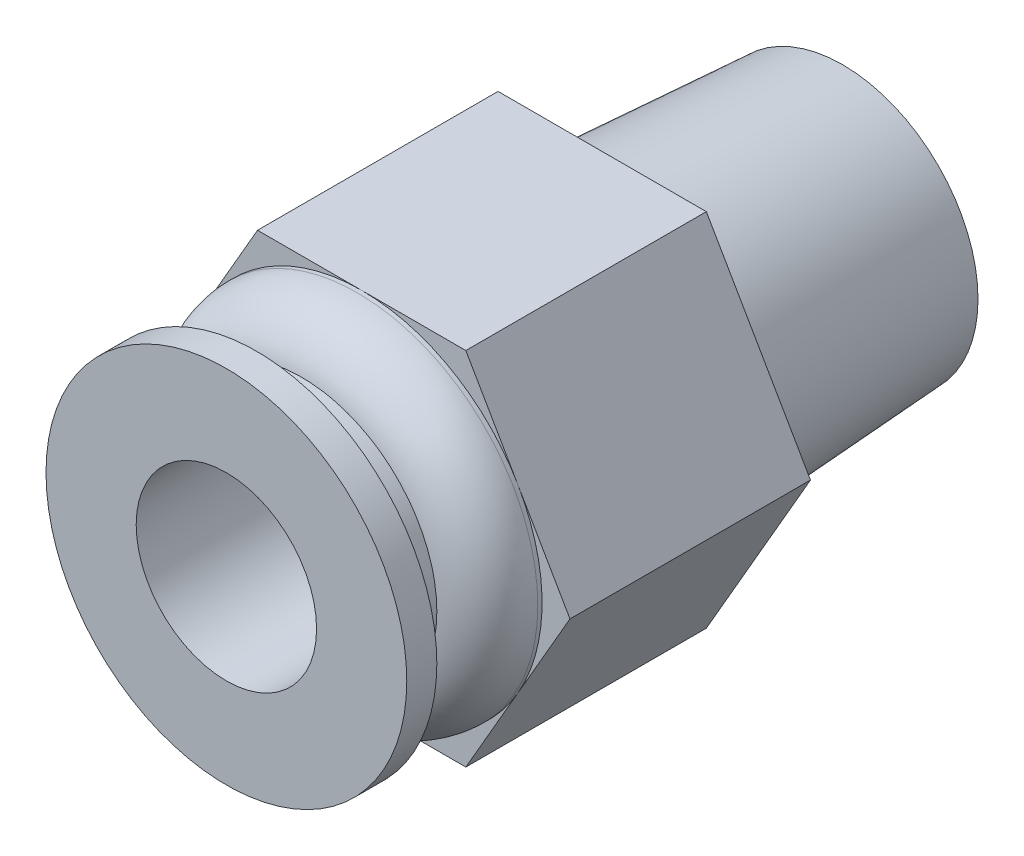
ISO-10303-21;
HEADER;
FILE_DESCRIPTION(('STEP AP214'),'2;1');
FILE_NAME('part.step','',(''),(''),'','','');
FILE_SCHEMA(('AUTOMOTIVE_DESIGN { 1 0 10303 214 1 1 1 1 }'));
ENDSEC;
DATA;
#1=APPLICATION_CONTEXT('core data for automotive mechanical design processes');
#2=APPLICATION_PROTOCOL_DEFINITION('international standard','automotive_design',2000,#1);
#3=PRODUCT_CONTEXT('',#1,'mechanical');
#4=PRODUCT('Part','Part','',(#3));
#5=PRODUCT_RELATED_PRODUCT_CATEGORY('part','',(#4));
#6=PRODUCT_DEFINITION_FORMATION('','',#4);
#7=PRODUCT_DEFINITION_CONTEXT('part definition',#1,'design');
#8=PRODUCT_DEFINITION('design','',#6,#7);
#9=PRODUCT_DEFINITION_SHAPE('','',#8);
#10=(LENGTH_UNIT() NAMED_UNIT(*) SI_UNIT(.MILLI.,.METRE.));
#11=(NAMED_UNIT(*) PLANE_ANGLE_UNIT() SI_UNIT($,.RADIAN.));
#12=(NAMED_UNIT(*) SI_UNIT($,.STERADIAN.) SOLID_ANGLE_UNIT());
#13=UNCERTAINTY_MEASURE_WITH_UNIT(LENGTH_MEASURE(1.E-05),#10,'distance_accuracy_value','');
#14=(GEOMETRIC_REPRESENTATION_CONTEXT(3) GLOBAL_UNCERTAINTY_ASSIGNED_CONTEXT((#13)) GLOBAL_UNIT_ASSIGNED_CONTEXT((#10,
#11,#12)) REPRESENTATION_CONTEXT('',''));
#15=CARTESIAN_POINT('',(0.,0.,0.));
#16=DIRECTION('',(0.,0.,1.));
#17=DIRECTION('',(1.,0.,0.));
#18=AXIS2_PLACEMENT_3D('',#15,#16,#17);
#19=CARTESIAN_POINT('',(0.,0.,16.));
#20=DIRECTION('',(0.,0.,1.));
#21=DIRECTION('',(1.,0.,0.));
#22=AXIS2_PLACEMENT_3D('',#19,#20,#21);
#23=PLANE('',#22);
#24=CARTESIAN_POINT('',(0.,0.,16.));
#25=DIRECTION('',(0.,0.,1.));
#26=DIRECTION('',(1.,0.,0.));
#27=AXIS2_PLACEMENT_3D('',#24,#25,#26);
#28=CIRCLE('',#27,6.);
#29=CARTESIAN_POINT('',(5.19615242270663,3.,16.));
#30=VERTEX_POINT('',#29);
#31=CARTESIAN_POINT('',(0.,6.,16.));
#32=VERTEX_POINT('',#31);
#33=EDGE_CURVE('E213',#30,#32,#28,.T.);
#34=ORIENTED_EDGE('',*,*,#33,.F.);
#35=DIRECTION('',(-0.5,0.866025403784439,0.));
#36=VECTOR('',#35,1.);
#37=CARTESIAN_POINT('',(6.92820323027551,0.,16.));
#38=LINE('',#37,#36);
#39=CARTESIAN_POINT('',(3.46410161513775,6.,16.));
#40=VERTEX_POINT('',#39);
#41=EDGE_CURVE('E221',#30,#40,#38,.T.);
#42=ORIENTED_EDGE('',*,*,#41,.T.);
#43=DIRECTION('',(-1.,0.,0.));
#44=VECTOR('',#43,1.);
#45=CARTESIAN_POINT('',(3.46410161513775,6.,16.));
#46=LINE('',#45,#44);
#47=EDGE_CURVE('E226',#40,#32,#46,.T.);
#48=ORIENTED_EDGE('',*,*,#47,.T.);
#49=EDGE_LOOP('',(#34,#42,#48));
#50=FACE_BOUND('',#49,.T.);
#51=ADVANCED_FACE('F39',(#50),#23,.T.);
#52=CARTESIAN_POINT('',(-5.19615242270663,3.,16.));
#53=VERTEX_POINT('',#52);
#54=EDGE_CURVE('E217',#32,#53,#28,.T.);
#55=ORIENTED_EDGE('',*,*,#54,.F.);
#56=CARTESIAN_POINT('',(-3.46410161513776,6.,16.));
#57=VERTEX_POINT('',#56);
#58=EDGE_CURVE('E225',#32,#57,#46,.T.);
#59=ORIENTED_EDGE('',*,*,#58,.T.);
#60=DIRECTION('',(-0.5,-0.866025403784439,0.));
#61=VECTOR('',#60,1.);
#62=CARTESIAN_POINT('',(-3.46410161513776,6.,16.));
#63=LINE('',#62,#61);
#64=EDGE_CURVE('E230',#57,#53,#63,.T.);
#65=ORIENTED_EDGE('',*,*,#64,.T.);
#66=EDGE_LOOP('',(#55,#59,#65));
#67=FACE_BOUND('',#66,.T.);
#68=ADVANCED_FACE('F345',(#67),#23,.T.);
#69=CARTESIAN_POINT('',(-5.19615242270663,-3.,16.));
#70=VERTEX_POINT('',#69);
#71=EDGE_CURVE('E362',#53,#70,#28,.T.);
#72=ORIENTED_EDGE('',*,*,#71,.F.);
#73=CARTESIAN_POINT('',(-6.92820323027551,0.,16.));
#74=VERTEX_POINT('',#73);
#75=EDGE_CURVE('E229',#53,#74,#63,.T.);
#76=ORIENTED_EDGE('',*,*,#75,.T.);
#77=DIRECTION('',(0.5,-0.866025403784439,0.));
#78=VECTOR('',#77,1.);
#79=CARTESIAN_POINT('',(-6.92820323027551,0.,16.));
#80=LINE('',#79,#78);
#81=EDGE_CURVE('E234',#74,#70,#80,.T.);
#82=ORIENTED_EDGE('',*,*,#81,.T.);
#83=EDGE_LOOP('',(#72,#76,#82));
#84=FACE_BOUND('',#83,.T.);
#85=ADVANCED_FACE('F350',(#84),#23,.T.);
#86=CARTESIAN_POINT('',(0.,-6.,16.));
#87=VERTEX_POINT('',#86);
#88=EDGE_CURVE('E361',#70,#87,#28,.T.);
#89=ORIENTED_EDGE('',*,*,#88,.F.);
#90=CARTESIAN_POINT('',(-3.46410161513776,-6.,16.));
#91=VERTEX_POINT('',#90);
#92=EDGE_CURVE('E233',#70,#91,#80,.T.);
#93=ORIENTED_EDGE('',*,*,#92,.T.);
#94=DIRECTION('',(1.,0.,0.));
#95=VECTOR('',#94,1.);
#96=CARTESIAN_POINT('',(-3.46410161513776,-6.,16.));
#97=LINE('',#96,#95);
#98=EDGE_CURVE('E238',#91,#87,#97,.T.);
#99=ORIENTED_EDGE('',*,*,#98,.T.);
#100=EDGE_LOOP('',(#89,#93,#99));
#101=FACE_BOUND('',#100,.T.);
#102=ADVANCED_FACE('F341',(#101),#23,.T.);
#103=CARTESIAN_POINT('',(5.19615242270663,-3.,16.));
#104=VERTEX_POINT('',#103);
#105=EDGE_CURVE('E69',#87,#104,#28,.T.);
#106=ORIENTED_EDGE('',*,*,#105,.F.);
#107=CARTESIAN_POINT('',(3.46410161513775,-6.,16.));
#108=VERTEX_POINT('',#107);
#109=EDGE_CURVE('E237',#87,#108,#97,.T.);
#110=ORIENTED_EDGE('',*,*,#109,.T.);
#111=DIRECTION('',(0.5,0.866025403784439,0.));
#112=VECTOR('',#111,1.);
#113=CARTESIAN_POINT('',(3.46410161513775,-6.,16.));
#114=LINE('',#113,#112);
#115=EDGE_CURVE('E219',#108,#104,#114,.T.);
#116=ORIENTED_EDGE('',*,*,#115,.T.);
#117=EDGE_LOOP('',(#106,#110,#116));
#118=FACE_BOUND('',#117,.T.);
#119=ADVANCED_FACE('F305',(#118),#23,.T.);
#120=CARTESIAN_POINT('',(0.,0.,0.));
#121=DIRECTION('',(0.,0.,1.));
#122=DIRECTION('',(1.,0.,0.));
#123=AXIS2_PLACEMENT_3D('',#120,#121,#122);
#124=CONICAL_SURFACE('',#123,4.5,0.0610865238198017);
#125=CARTESIAN_POINT('',(0.,0.,8.));
#126=DIRECTION('',(0.,0.,1.));
#127=DIRECTION('',(1.,0.,0.));
#128=AXIS2_PLACEMENT_3D('',#125,#126,#127);
#129=CIRCLE('',#128,4.98930096120387);
#130=CARTESIAN_POINT('',(4.98930096120387,0.,8.));
#131=VERTEX_POINT('',#130);
#132=EDGE_CURVE('E274',#131,#131,#129,.T.);
#133=ORIENTED_EDGE('',*,*,#132,.F.);
#134=EDGE_LOOP('',(#133));
#135=FACE_BOUND('',#134,.T.);
#136=CARTESIAN_POINT('',(0.,0.,0.));
#137=DIRECTION('',(0.,0.,1.));
#138=DIRECTION('',(1.,0.,0.));
#139=AXIS2_PLACEMENT_3D('',#136,#137,#138);
#140=CIRCLE('',#139,4.5);
#141=CARTESIAN_POINT('',(4.5,0.,0.));
#142=VERTEX_POINT('',#141);
#143=EDGE_CURVE('E271',#142,#142,#140,.T.);
#144=ORIENTED_EDGE('',*,*,#143,.T.);
#145=EDGE_LOOP('',(#144));
#146=FACE_BOUND('',#145,.T.);
#147=ADVANCED_FACE('F334',(#135,#146),#124,.T.);
#148=CARTESIAN_POINT('',(0.,0.,0.));
#149=DIRECTION('',(0.,0.,1.));
#150=DIRECTION('',(1.,0.,0.));
#151=AXIS2_PLACEMENT_3D('',#148,#149,#150);
#152=PLANE('',#151);
#153=CARTESIAN_POINT('',(0.,0.,0.));
#154=DIRECTION('',(0.,0.,-1.));
#155=DIRECTION('',(-1.,0.,0.));
#156=AXIS2_PLACEMENT_3D('',#153,#154,#155);
#157=CIRCLE('',#156,3.175);
#158=CARTESIAN_POINT('',(-3.175,0.,0.));
#159=VERTEX_POINT('',#158);
#160=EDGE_CURVE('E452',#159,#159,#157,.T.);
#161=ORIENTED_EDGE('',*,*,#160,.F.);
#162=EDGE_LOOP('',(#161));
#163=FACE_BOUND('',#162,.T.);
#164=ORIENTED_EDGE('',*,*,#143,.F.);
#165=EDGE_LOOP('',(#164));
#166=FACE_BOUND('',#165,.T.);
#167=ADVANCED_FACE('F331',(#163,#166),#152,.F.);
#168=CARTESIAN_POINT('',(3.46410161513775,-6.,16.));
#169=DIRECTION('',(-0.866025403784439,0.5,0.));
#170=DIRECTION('',(-0.5,-0.866025403784439,0.));
#171=AXIS2_PLACEMENT_3D('',#168,#169,#170);
#172=PLANE('',#171);
#173=DIRECTION('',(0.5,0.866025403784439,0.));
#174=VECTOR('',#173,1.);
#175=CARTESIAN_POINT('',(3.46410161513775,-6.,8.));
#176=LINE('',#175,#174);
#177=CARTESIAN_POINT('',(3.46410161513775,-6.,8.));
#178=VERTEX_POINT('',#177);
#179=CARTESIAN_POINT('',(6.92820323027551,0.,8.));
#180=VERTEX_POINT('',#179);
#181=EDGE_CURVE('E216',#178,#180,#176,.T.);
#182=ORIENTED_EDGE('',*,*,#181,.T.);
#183=DIRECTION('',(0.,0.,-1.));
#184=VECTOR('',#183,1.);
#185=CARTESIAN_POINT('',(6.92820323027551,0.,16.));
#186=LINE('',#185,#184);
#187=CARTESIAN_POINT('',(6.92820323027551,0.,16.));
#188=VERTEX_POINT('',#187);
#189=EDGE_CURVE('E268',#188,#180,#186,.T.);
#190=ORIENTED_EDGE('',*,*,#189,.F.);
#191=EDGE_CURVE('E222',#104,#188,#114,.T.);
#192=ORIENTED_EDGE('',*,*,#191,.F.);
#193=ORIENTED_EDGE('',*,*,#115,.F.);
#194=DIRECTION('',(0.,0.,-1.));
#195=VECTOR('',#194,1.);
#196=CARTESIAN_POINT('',(3.46410161513775,-6.,16.));
#197=LINE('',#196,#195);
#198=EDGE_CURVE('E241',#108,#178,#197,.T.);
#199=ORIENTED_EDGE('',*,*,#198,.T.);
#200=EDGE_LOOP('',(#182,#190,#192,#193,#199));
#201=FACE_BOUND('',#200,.T.);
#202=ADVANCED_FACE('F327',(#201),#172,.F.);
#203=CARTESIAN_POINT('',(6.92820323027551,0.,16.));
#204=DIRECTION('',(-0.866025403784439,-0.5,0.));
#205=DIRECTION('',(0.5,-0.866025403784439,0.));
#206=AXIS2_PLACEMENT_3D('',#203,#204,#205);
#207=PLANE('',#206);
#208=DIRECTION('',(-0.5,0.866025403784439,0.));
#209=VECTOR('',#208,1.);
#210=CARTESIAN_POINT('',(6.92820323027551,0.,8.));
#211=LINE('',#210,#209);
#212=CARTESIAN_POINT('',(3.46410161513775,6.,8.));
#213=VERTEX_POINT('',#212);
#214=EDGE_CURVE('E244',#180,#213,#211,.T.);
#215=ORIENTED_EDGE('',*,*,#214,.T.);
#216=DIRECTION('',(0.,0.,-1.));
#217=VECTOR('',#216,1.);
#218=CARTESIAN_POINT('',(3.46410161513775,6.,16.));
#219=LINE('',#218,#217);
#220=EDGE_CURVE('E265',#40,#213,#219,.T.);
#221=ORIENTED_EDGE('',*,*,#220,.F.);
#222=ORIENTED_EDGE('',*,*,#41,.F.);
#223=EDGE_CURVE('E223',#188,#30,#38,.T.);
#224=ORIENTED_EDGE('',*,*,#223,.F.);
#225=ORIENTED_EDGE('',*,*,#189,.T.);
#226=EDGE_LOOP('',(#215,#221,#222,#224,#225));
#227=FACE_BOUND('',#226,.T.);
#228=ADVANCED_FACE('F323',(#227),#207,.F.);
#229=CARTESIAN_POINT('',(3.46410161513775,6.,16.));
#230=DIRECTION('',(0.,-1.,0.));
#231=DIRECTION('',(0.,0.,-1.));
#232=AXIS2_PLACEMENT_3D('',#229,#230,#231);
#233=PLANE('',#232);
#234=DIRECTION('',(-1.,0.,0.));
#235=VECTOR('',#234,1.);
#236=CARTESIAN_POINT('',(3.46410161513775,6.,8.));
#237=LINE('',#236,#235);
#238=CARTESIAN_POINT('',(-3.46410161513776,6.,8.));
#239=VERTEX_POINT('',#238);
#240=EDGE_CURVE('E246',#213,#239,#237,.T.);
#241=ORIENTED_EDGE('',*,*,#240,.T.);
#242=DIRECTION('',(0.,0.,-1.));
#243=VECTOR('',#242,1.);
#244=CARTESIAN_POINT('',(-3.46410161513776,6.,16.));
#245=LINE('',#244,#243);
#246=EDGE_CURVE('E262',#57,#239,#245,.T.);
#247=ORIENTED_EDGE('',*,*,#246,.F.);
#248=ORIENTED_EDGE('',*,*,#58,.F.);
#249=ORIENTED_EDGE('',*,*,#47,.F.);
#250=ORIENTED_EDGE('',*,*,#220,.T.);
#251=EDGE_LOOP('',(#241,#247,#248,#249,#250));
#252=FACE_BOUND('',#251,.T.);
#253=ADVANCED_FACE('F319',(#252),#233,.F.);
#254=CARTESIAN_POINT('',(-3.46410161513776,6.,16.));
#255=DIRECTION('',(0.866025403784439,-0.5,0.));
#256=DIRECTION('',(0.5,0.866025403784439,0.));
#257=AXIS2_PLACEMENT_3D('',#254,#255,#256);
#258=PLANE('',#257);
#259=DIRECTION('',(-0.5,-0.866025403784439,0.));
#260=VECTOR('',#259,1.);
#261=CARTESIAN_POINT('',(-3.46410161513776,6.,8.));
#262=LINE('',#261,#260);
#263=CARTESIAN_POINT('',(-6.92820323027551,0.,8.));
#264=VERTEX_POINT('',#263);
#265=EDGE_CURVE('E248',#239,#264,#262,.T.);
#266=ORIENTED_EDGE('',*,*,#265,.T.);
#267=DIRECTION('',(0.,0.,-1.));
#268=VECTOR('',#267,1.);
#269=CARTESIAN_POINT('',(-6.92820323027551,0.,16.));
#270=LINE('',#269,#268);
#271=EDGE_CURVE('E259',#74,#264,#270,.T.);
#272=ORIENTED_EDGE('',*,*,#271,.F.);
#273=ORIENTED_EDGE('',*,*,#75,.F.);
#274=ORIENTED_EDGE('',*,*,#64,.F.);
#275=ORIENTED_EDGE('',*,*,#246,.T.);
#276=EDGE_LOOP('',(#266,#272,#273,#274,#275));
#277=FACE_BOUND('',#276,.T.);
#278=ADVANCED_FACE('F315',(#277),#258,.F.);
#279=CARTESIAN_POINT('',(-6.92820323027551,0.,16.));
#280=DIRECTION('',(0.866025403784439,0.5,0.));
#281=DIRECTION('',(-0.5,0.866025403784439,0.));
#282=AXIS2_PLACEMENT_3D('',#279,#280,#281);
#283=PLANE('',#282);
#284=DIRECTION('',(0.5,-0.866025403784439,0.));
#285=VECTOR('',#284,1.);
#286=CARTESIAN_POINT('',(-6.92820323027551,0.,8.));
#287=LINE('',#286,#285);
#288=CARTESIAN_POINT('',(-3.46410161513776,-6.,8.));
#289=VERTEX_POINT('',#288);
#290=EDGE_CURVE('E250',#264,#289,#287,.T.);
#291=ORIENTED_EDGE('',*,*,#290,.T.);
#292=DIRECTION('',(0.,0.,-1.));
#293=VECTOR('',#292,1.);
#294=CARTESIAN_POINT('',(-3.46410161513776,-6.,16.));
#295=LINE('',#294,#293);
#296=EDGE_CURVE('E256',#91,#289,#295,.T.);
#297=ORIENTED_EDGE('',*,*,#296,.F.);
#298=ORIENTED_EDGE('',*,*,#92,.F.);
#299=ORIENTED_EDGE('',*,*,#81,.F.);
#300=ORIENTED_EDGE('',*,*,#271,.T.);
#301=EDGE_LOOP('',(#291,#297,#298,#299,#300));
#302=FACE_BOUND('',#301,.T.);
#303=ADVANCED_FACE('F311',(#302),#283,.F.);
#304=CARTESIAN_POINT('',(-3.46410161513776,-6.,16.));
#305=DIRECTION('',(0.,1.,0.));
#306=DIRECTION('',(-1.,0.,0.));
#307=AXIS2_PLACEMENT_3D('',#304,#305,#306);
#308=PLANE('',#307);
#309=DIRECTION('',(1.,0.,0.));
#310=VECTOR('',#309,1.);
#311=CARTESIAN_POINT('',(-3.46410161513776,-6.,8.));
#312=LINE('',#311,#310);
#313=EDGE_CURVE('E252',#289,#178,#312,.T.);
#314=ORIENTED_EDGE('',*,*,#313,.T.);
#315=ORIENTED_EDGE('',*,*,#198,.F.);
#316=ORIENTED_EDGE('',*,*,#109,.F.);
#317=ORIENTED_EDGE('',*,*,#98,.F.);
#318=ORIENTED_EDGE('',*,*,#296,.T.);
#319=EDGE_LOOP('',(#314,#315,#316,#317,#318));
#320=FACE_BOUND('',#319,.T.);
#321=ADVANCED_FACE('F303',(#320),#308,.F.);
#322=EDGE_CURVE('E218',#104,#30,#28,.T.);
#323=ORIENTED_EDGE('',*,*,#322,.F.);
#324=ORIENTED_EDGE('',*,*,#191,.T.);
#325=ORIENTED_EDGE('',*,*,#223,.T.);
#326=EDGE_LOOP('',(#323,#324,#325));
#327=FACE_BOUND('',#326,.T.);
#328=ADVANCED_FACE('F300',(#327),#23,.T.);
#329=CARTESIAN_POINT('',(0.,0.,8.));
#330=DIRECTION('',(0.,0.,1.));
#331=DIRECTION('',(1.,0.,0.));
#332=AXIS2_PLACEMENT_3D('',#329,#330,#331);
#333=PLANE('',#332);
#334=ORIENTED_EDGE('',*,*,#132,.T.);
#335=EDGE_LOOP('',(#334));
#336=FACE_BOUND('',#335,.T.);
#337=ORIENTED_EDGE('',*,*,#181,.F.);
#338=ORIENTED_EDGE('',*,*,#313,.F.);
#339=ORIENTED_EDGE('',*,*,#290,.F.);
#340=ORIENTED_EDGE('',*,*,#265,.F.);
#341=ORIENTED_EDGE('',*,*,#240,.F.);
#342=ORIENTED_EDGE('',*,*,#214,.F.);
#343=EDGE_LOOP('',(#337,#338,#339,#340,#341,#342));
#344=FACE_BOUND('',#343,.T.);
#345=ADVANCED_FACE('F297',(#336,#344),#333,.F.);
#346=CARTESIAN_POINT('',(0.,0.,18.));
#347=DIRECTION('',(0.,0.,-1.));
#348=DIRECTION('',(-1.,0.,0.));
#349=AXIS2_PLACEMENT_3D('',#346,#347,#348);
#350=CYLINDRICAL_SURFACE('',#349,6.);
#351=CARTESIAN_POINT('',(6.,0.,16.1425824378993));
#352=CARTESIAN_POINT('',(6.,0.785398159762403,16.1425824378993));
#353=CARTESIAN_POINT('',(5.8438360586185,1.57048730951482,16.1425824378993));
#354=CARTESIAN_POINT('',(5.24271833151695,3.02171387886626,16.1425824378993));
#355=CARTESIAN_POINT('',(4.798001051818,3.68728032242057,16.1425824378993));
#356=CARTESIAN_POINT('',(3.68728032242057,4.798001051818,16.1425824378993));
#357=CARTESIAN_POINT('',(3.02171387886599,5.24271833151706,16.1425824378993));
#358=CARTESIAN_POINT('',(1.57048730951508,5.84383605861839,16.1425824378993));
#359=CARTESIAN_POINT('',(0.785398159761346,6.,16.1425824378993));
#360=CARTESIAN_POINT('',(-0.785398159761346,6.,16.1425824378993));
#361=CARTESIAN_POINT('',(-1.57048730951479,5.8438360586185,16.1425824378993));
#362=CARTESIAN_POINT('',(-3.02171387886629,5.24271833151694,16.1425824378993));
#363=CARTESIAN_POINT('',(-3.68728032242064,4.79800105181794,16.1425824378993));
#364=CARTESIAN_POINT('',(-4.79800105181794,3.68728032242063,16.1425824378993));
#365=CARTESIAN_POINT('',(-5.24271833151698,3.02171387886617,16.1425824378993));
#366=CARTESIAN_POINT('',(-5.84383605861845,1.57048730951492,16.1425824378993));
#367=CARTESIAN_POINT('',(-6.,0.785398159761347,16.1425824378993));
#368=CARTESIAN_POINT('',(-6.,-0.785398159761345,16.1425824378993));
#369=CARTESIAN_POINT('',(-5.84383605861841,-1.57048730951502,16.1425824378993));
#370=CARTESIAN_POINT('',(-5.24271833151704,-3.02171387886604,16.1425824378993));
#371=CARTESIAN_POINT('',(-4.79800105181794,-3.68728032242064,16.1425824378993));
#372=CARTESIAN_POINT('',(-3.68728032242063,-4.79800105181794,16.1425824378993));
#373=CARTESIAN_POINT('',(-3.02171387886605,-5.24271833151703,16.1425824378993));
#374=CARTESIAN_POINT('',(-1.57048730951504,-5.8438360586184,16.1425824378993));
#375=CARTESIAN_POINT('',(-0.785398159761338,-6.,16.1425824378993));
#376=CARTESIAN_POINT('',(0.785398159761357,-6.,16.1425824378993));
#377=CARTESIAN_POINT('',(1.57048730951517,-5.84383605861835,16.1425824378993));
#378=CARTESIAN_POINT('',(3.02171387886589,-5.2427183315171,16.1425824378993));
#379=CARTESIAN_POINT('',(3.68728032242045,-4.79800105181812,16.1425824378993));
#380=CARTESIAN_POINT('',(4.7980010518181,-3.68728032242048,16.1425824378993));
#381=CARTESIAN_POINT('',(5.24271833151709,-3.02171387886591,16.1425824378993));
#382=CARTESIAN_POINT('',(5.84383605861834,-1.57048730951519,16.1425824378993));
#383=CARTESIAN_POINT('',(6.,-0.785398159762404,16.1425824378993));
#384=CARTESIAN_POINT('',(6.,0.,16.1425824378993));
#385=(BOUNDED_CURVE() B_SPLINE_CURVE(3,(#351,#352,#353,#354,#355,#356,#357,#358,#359,#360,#361,
#362,#363,#364,#365,#366,#367,#368,#369,#370,#371,#372,#373,#374,#375,#376,#377,#378,#379,#380,
#381,#382,#383,#384),.UNSPECIFIED.,.T.,.F.) B_SPLINE_CURVE_WITH_KNOTS((4,2,2,2,2,2,2,2,2,2,2,2,
2,2,2,2,4),(0.,0.392699081698724,0.785398163397448,1.17809724509617,1.5707963267949,
1.96349540849362,2.35619449019234,2.74889357189107,3.14159265358979,3.53429173528852,
3.92699081698724,4.31968989868597,4.71238898038469,5.10508806208341,5.49778714378214,
5.89048622548086,6.28318530717959),
.UNSPECIFIED.) CURVE() GEOMETRIC_REPRESENTATION_ITEM() RATIONAL_B_SPLINE_CURVE((1.,1.,1.,1.,1.,
1.,1.,1.,1.,1.,1.,1.,1.,1.,1.,1.,1.,1.,1.,1.,1.,1.,1.,1.,1.,1.,1.,1.,1.,1.,1.,1.,1.,1.)) REPRESENTATION_ITEM(''));
#386=CARTESIAN_POINT('',(6.,0.,16.1425824378993));
#387=VERTEX_POINT('',#386);
#388=EDGE_CURVE('E53',#387,#387,#385,.F.);
#389=ORIENTED_EDGE('',*,*,#388,.T.);
#390=EDGE_LOOP('',(#389));
#391=FACE_BOUND('',#390,.T.);
#392=ORIENTED_EDGE('',*,*,#33,.T.);
#393=ORIENTED_EDGE('',*,*,#54,.T.);
#394=ORIENTED_EDGE('',*,*,#71,.T.);
#395=ORIENTED_EDGE('',*,*,#88,.T.);
#396=ORIENTED_EDGE('',*,*,#105,.T.);
#397=ORIENTED_EDGE('',*,*,#322,.T.);
#398=EDGE_LOOP('',(#392,#393,#394,#395,#396,#397));
#399=FACE_BOUND('',#398,.T.);
#400=ADVANCED_FACE('F287',(#391,#399),#350,.T.);
#401=CARTESIAN_POINT('',(0.,0.,18.5));
#402=DIRECTION('',(0.,0.,-1.));
#403=DIRECTION('',(-1.,0.,0.));
#404=AXIS2_PLACEMENT_3D('',#401,#402,#403);
#405=CYLINDRICAL_SURFACE('',#404,4.5);
#406=CARTESIAN_POINT('',(0.,0.,18.5));
#407=DIRECTION('',(0.,0.,1.));
#408=DIRECTION('',(1.,0.,0.));
#409=AXIS2_PLACEMENT_3D('',#406,#407,#408);
#410=CIRCLE('',#409,4.5);
#411=CARTESIAN_POINT('',(4.5,0.,18.5));
#412=VERTEX_POINT('',#411);
#413=EDGE_CURVE('E209',#412,#412,#410,.T.);
#414=ORIENTED_EDGE('',*,*,#413,.F.);
#415=EDGE_LOOP('',(#414));
#416=FACE_BOUND('',#415,.T.);
#417=CARTESIAN_POINT('',(4.5,0.,18.));
#418=CARTESIAN_POINT('',(4.5,-0.589048619821803,18.));
#419=CARTESIAN_POINT('',(4.38287704396395,-1.17786548213645,18.));
#420=CARTESIAN_POINT('',(3.93203874863763,-2.26628540914936,18.));
#421=CARTESIAN_POINT('',(3.59850078886344,-2.76546024181531,18.));
#422=CARTESIAN_POINT('',(2.76546024181546,-3.59850078886363,18.));
#423=CARTESIAN_POINT('',(2.26628540914944,-3.93203874863763,18.));
#424=CARTESIAN_POINT('',(1.17786548213636,-4.38287704396395,18.));
#425=CARTESIAN_POINT('',(0.589048619821017,-4.5,18.));
#426=CARTESIAN_POINT('',(-0.589048619821003,-4.5,18.));
#427=CARTESIAN_POINT('',(-1.17786548213637,-4.38287704396395,18.));
#428=CARTESIAN_POINT('',(-2.26628540914945,-3.93203874863763,18.));
#429=CARTESIAN_POINT('',(-2.76546024181564,-3.59850078886346,18.));
#430=CARTESIAN_POINT('',(-3.59850078886328,-2.76546024181548,18.));
#431=CARTESIAN_POINT('',(-3.93203874863763,-2.26628540914961,18.));
#432=CARTESIAN_POINT('',(-4.38287704396395,-1.17786548213619,18.));
#433=CARTESIAN_POINT('',(-4.5,-0.589048619821009,18.));
#434=CARTESIAN_POINT('',(-4.5,0.58904861982101,18.));
#435=CARTESIAN_POINT('',(-4.38287704396395,1.1778654821362,18.));
#436=CARTESIAN_POINT('',(-3.93203874863763,2.26628540914962,18.));
#437=CARTESIAN_POINT('',(-3.59850078886329,2.76546024181547,18.));
#438=CARTESIAN_POINT('',(-2.76546024181565,3.59850078886345,18.));
#439=CARTESIAN_POINT('',(-2.26628540914957,3.93203874863767,18.));
#440=CARTESIAN_POINT('',(-1.17786548213624,4.38287704396391,18.));
#441=CARTESIAN_POINT('',(-0.589048619821009,4.5,18.));
#442=CARTESIAN_POINT('',(0.58904861982101,4.5,18.));
#443=CARTESIAN_POINT('',(1.17786548213623,4.38287704396391,18.));
#444=CARTESIAN_POINT('',(2.26628540914957,3.93203874863767,18.));
#445=CARTESIAN_POINT('',(2.7654602418156,3.59850078886333,18.));
#446=CARTESIAN_POINT('',(3.59850078886333,2.7654602418156,18.));
#447=CARTESIAN_POINT('',(3.93203874863767,2.26628540914949,18.));
#448=CARTESIAN_POINT('',(4.38287704396391,1.17786548213632,18.));
#449=CARTESIAN_POINT('',(4.5,0.589048619821802,18.));
#450=CARTESIAN_POINT('',(4.5,0.,18.));
#451=(BOUNDED_CURVE() B_SPLINE_CURVE(3,(#417,#418,#419,#420,#421,#422,#423,#424,#425,#426,#427,
#428,#429,#430,#431,#432,#433,#434,#435,#436,#437,#438,#439,#440,#441,#442,#443,#444,#445,#446,
#447,#448,#449,#450),.UNSPECIFIED.,.T.,.F.) B_SPLINE_CURVE_WITH_KNOTS((4,2,2,2,2,2,2,2,2,2,2,2,
2,2,2,2,4),(0.,0.392699081698725,0.785398163397448,1.17809724509617,1.5707963267949,
1.96349540849362,2.35619449019234,2.74889357189107,3.14159265358979,3.53429173528852,
3.92699081698724,4.31968989868597,4.71238898038469,5.10508806208341,5.49778714378214,
5.89048622548086,6.28318530717959),
.UNSPECIFIED.) CURVE() GEOMETRIC_REPRESENTATION_ITEM() RATIONAL_B_SPLINE_CURVE((1.,1.,1.,1.,1.,
1.,1.,1.,1.,1.,1.,1.,1.,1.,1.,1.,1.,1.,1.,1.,1.,1.,1.,1.,1.,1.,1.,1.,1.,1.,1.,1.,1.,1.)) REPRESENTATION_ITEM(''));
#452=CARTESIAN_POINT('',(4.5,0.,18.));
#453=VERTEX_POINT('',#452);
#454=EDGE_CURVE('E364',#453,#453,#451,.F.);
#455=ORIENTED_EDGE('',*,*,#454,.T.);
#456=EDGE_LOOP('',(#455));
#457=FACE_BOUND('',#456,.T.);
#458=ADVANCED_FACE('F296',(#416,#457),#405,.T.);
#459=CARTESIAN_POINT('',(0.,0.,18.5));
#460=DIRECTION('',(0.,0.,1.));
#461=DIRECTION('',(1.,0.,0.));
#462=AXIS2_PLACEMENT_3D('',#459,#460,#461);
#463=PLANE('',#462);
#464=CARTESIAN_POINT('',(0.,0.,18.5));
#465=DIRECTION('',(0.,0.,1.));
#466=DIRECTION('',(1.,0.,0.));
#467=AXIS2_PLACEMENT_3D('',#464,#465,#466);
#468=CIRCLE('',#467,3.75);
#469=CARTESIAN_POINT('',(3.75,0.,18.5));
#470=VERTEX_POINT('',#469);
#471=EDGE_CURVE('E14',#470,#470,#468,.T.);
#472=ORIENTED_EDGE('',*,*,#471,.F.);
#473=EDGE_LOOP('',(#472));
#474=FACE_BOUND('',#473,.T.);
#475=ORIENTED_EDGE('',*,*,#413,.T.);
#476=EDGE_LOOP('',(#475));
#477=FACE_BOUND('',#476,.T.);
#478=ADVANCED_FACE('F387',(#474,#477),#463,.T.);
#479=CARTESIAN_POINT('',(4.5,0.,18.));
#480=CARTESIAN_POINT('',(4.5,0.589048619821802,18.));
#481=CARTESIAN_POINT('',(4.38287704396391,1.17786548213632,18.));
#482=CARTESIAN_POINT('',(3.93203874863767,2.26628540914949,18.));
#483=CARTESIAN_POINT('',(3.59850078886333,2.7654602418156,18.));
#484=CARTESIAN_POINT('',(2.7654602418156,3.59850078886333,18.));
#485=CARTESIAN_POINT('',(2.26628540914957,3.93203874863767,18.));
#486=CARTESIAN_POINT('',(1.17786548213623,4.38287704396391,18.));
#487=CARTESIAN_POINT('',(0.58904861982101,4.5,18.));
#488=CARTESIAN_POINT('',(-0.589048619821009,4.5,18.));
#489=CARTESIAN_POINT('',(-1.17786548213624,4.38287704396391,18.));
#490=CARTESIAN_POINT('',(-2.26628540914957,3.93203874863767,18.));
#491=CARTESIAN_POINT('',(-2.76546024181565,3.59850078886345,18.));
#492=CARTESIAN_POINT('',(-3.59850078886329,2.76546024181547,18.));
#493=CARTESIAN_POINT('',(-3.93203874863763,2.26628540914962,18.));
#494=CARTESIAN_POINT('',(-4.38287704396395,1.1778654821362,18.));
#495=CARTESIAN_POINT('',(-4.5,0.58904861982101,18.));
#496=CARTESIAN_POINT('',(-4.5,-0.589048619821009,18.));
#497=CARTESIAN_POINT('',(-4.38287704396395,-1.17786548213619,18.));
#498=CARTESIAN_POINT('',(-3.93203874863763,-2.26628540914961,18.));
#499=CARTESIAN_POINT('',(-3.59850078886328,-2.76546024181548,18.));
#500=CARTESIAN_POINT('',(-2.76546024181564,-3.59850078886346,18.));
#501=CARTESIAN_POINT('',(-2.26628540914945,-3.93203874863763,18.));
#502=CARTESIAN_POINT('',(-1.17786548213637,-4.38287704396395,18.));
#503=CARTESIAN_POINT('',(-0.589048619821003,-4.5,18.));
#504=CARTESIAN_POINT('',(0.589048619821017,-4.5,18.));
#505=CARTESIAN_POINT('',(1.17786548213636,-4.38287704396395,18.));
#506=CARTESIAN_POINT('',(2.26628540914944,-3.93203874863763,18.));
#507=CARTESIAN_POINT('',(2.76546024181546,-3.59850078886363,18.));
#508=CARTESIAN_POINT('',(3.59850078886344,-2.76546024181531,18.));
#509=CARTESIAN_POINT('',(3.93203874863763,-2.26628540914936,18.));
#510=CARTESIAN_POINT('',(4.38287704396395,-1.17786548213645,18.));
#511=CARTESIAN_POINT('',(4.5,-0.589048619821803,18.));
#512=CARTESIAN_POINT('',(4.5,0.,18.));
#513=CARTESIAN_POINT('',(6.,0.,17.6769708587651));
#514=CARTESIAN_POINT('',(6.,0.785398159762403,17.6769708587651));
#515=CARTESIAN_POINT('',(5.84383605861923,1.57048730951498,17.6769708587651));
#516=CARTESIAN_POINT('',(5.24271833151622,3.0217138788661,17.6769708587651));
#517=CARTESIAN_POINT('',(4.798001051818,3.68728032242057,17.6769708587651));
#518=CARTESIAN_POINT('',(3.68728032242057,4.798001051818,17.6769708587651));
#519=CARTESIAN_POINT('',(3.02171387886593,5.2427183315169,17.6769708587651));
#520=CARTESIAN_POINT('',(1.57048730951515,5.84383605861855,17.6769708587651));
#521=CARTESIAN_POINT('',(0.785398159761346,6.00000000000034,17.6769708587651));
#522=CARTESIAN_POINT('',(-0.785398159761346,5.99999999999966,17.6769708587651));
#523=CARTESIAN_POINT('',(-1.57048730951481,5.84383605861889,17.6769708587651));
#524=CARTESIAN_POINT('',(-3.02171387886627,5.24271833151655,17.6769708587651));
#525=CARTESIAN_POINT('',(-3.68728032242063,4.79800105181794,17.6769708587651));
#526=CARTESIAN_POINT('',(-4.79800105181794,3.68728032242063,17.6769708587651));
#527=CARTESIAN_POINT('',(-5.24271833151695,3.02171387886616,17.6769708587651));
#528=CARTESIAN_POINT('',(-5.84383605861848,1.57048730951493,17.6769708587651));
#529=CARTESIAN_POINT('',(-6.,0.785398159761347,17.6769708587651));
#530=CARTESIAN_POINT('',(-6.,-0.785398159761345,17.6769708587651));
#531=CARTESIAN_POINT('',(-5.84383605861815,-1.57048730951492,17.6769708587651));
#532=CARTESIAN_POINT('',(-5.2427183315173,-3.02171387886615,17.6769708587651));
#533=CARTESIAN_POINT('',(-4.79800105181794,-3.68728032242063,17.6769708587651));
#534=CARTESIAN_POINT('',(-3.68728032242063,-4.79800105181794,17.6769708587651));
#535=CARTESIAN_POINT('',(-3.02171387886616,-5.24271833151729,17.6769708587651));
#536=CARTESIAN_POINT('',(-1.57048730951493,-5.84383605861814,17.6769708587651));
#537=CARTESIAN_POINT('',(-0.785398159761338,-6.,17.6769708587651));
#538=CARTESIAN_POINT('',(0.785398159761357,-6.,17.6769708587651));
#539=CARTESIAN_POINT('',(1.57048730951508,-5.84383605861815,17.6769708587651));
#540=CARTESIAN_POINT('',(3.02171387886597,-5.2427183315173,17.6769708587651));
#541=CARTESIAN_POINT('',(3.68728032242062,-4.79800105181829,17.6769708587651));
#542=CARTESIAN_POINT('',(4.79800105181793,-3.6872803224203,17.6769708587651));
#543=CARTESIAN_POINT('',(5.24271833151729,-3.02171387886599,17.6769708587651));
#544=CARTESIAN_POINT('',(5.84383605861814,-1.5704873095151,17.6769708587651));
#545=CARTESIAN_POINT('',(6.,-0.785398159762404,17.6769708587651));
#546=CARTESIAN_POINT('',(6.,0.,17.6769708587651));
#547=CARTESIAN_POINT('',(6.,0.,16.1425824378993));
#548=CARTESIAN_POINT('',(6.,0.785398159762403,16.1425824378993));
#549=CARTESIAN_POINT('',(5.8438360586185,1.57048730951482,16.1425824378993));
#550=CARTESIAN_POINT('',(5.24271833151695,3.02171387886626,16.1425824378993));
#551=CARTESIAN_POINT('',(4.798001051818,3.68728032242057,16.1425824378993));
#552=CARTESIAN_POINT('',(3.68728032242057,4.798001051818,16.1425824378993));
#553=CARTESIAN_POINT('',(3.02171387886599,5.24271833151706,16.1425824378993));
#554=CARTESIAN_POINT('',(1.57048730951508,5.84383605861839,16.1425824378993));
#555=CARTESIAN_POINT('',(0.785398159761346,6.,16.1425824378993));
#556=CARTESIAN_POINT('',(-0.785398159761346,6.,16.1425824378993));
#557=CARTESIAN_POINT('',(-1.57048730951479,5.8438360586185,16.1425824378993));
#558=CARTESIAN_POINT('',(-3.02171387886629,5.24271833151694,16.1425824378993));
#559=CARTESIAN_POINT('',(-3.68728032242064,4.79800105181794,16.1425824378993));
#560=CARTESIAN_POINT('',(-4.79800105181794,3.68728032242063,16.1425824378993));
#561=CARTESIAN_POINT('',(-5.24271833151698,3.02171387886617,16.1425824378993));
#562=CARTESIAN_POINT('',(-5.84383605861845,1.57048730951492,16.1425824378993));
#563=CARTESIAN_POINT('',(-6.,0.785398159761347,16.1425824378993));
#564=CARTESIAN_POINT('',(-6.,-0.785398159761345,16.1425824378993));
#565=CARTESIAN_POINT('',(-5.84383605861841,-1.57048730951502,16.1425824378993));
#566=CARTESIAN_POINT('',(-5.24271833151704,-3.02171387886604,16.1425824378993));
#567=CARTESIAN_POINT('',(-4.79800105181794,-3.68728032242064,16.1425824378993));
#568=CARTESIAN_POINT('',(-3.68728032242063,-4.79800105181794,16.1425824378993));
#569=CARTESIAN_POINT('',(-3.02171387886605,-5.24271833151703,16.1425824378993));
#570=CARTESIAN_POINT('',(-1.57048730951504,-5.8438360586184,16.1425824378993));
#571=CARTESIAN_POINT('',(-0.785398159761338,-6.,16.1425824378993));
#572=CARTESIAN_POINT('',(0.785398159761357,-6.,16.1425824378993));
#573=CARTESIAN_POINT('',(1.57048730951517,-5.84383605861835,16.1425824378993));
#574=CARTESIAN_POINT('',(3.02171387886589,-5.2427183315171,16.1425824378993));
#575=CARTESIAN_POINT('',(3.68728032242045,-4.79800105181812,16.1425824378993));
#576=CARTESIAN_POINT('',(4.7980010518181,-3.68728032242048,16.1425824378993));
#577=CARTESIAN_POINT('',(5.24271833151709,-3.02171387886591,16.1425824378993));
#578=CARTESIAN_POINT('',(5.84383605861834,-1.57048730951519,16.1425824378993));
#579=CARTESIAN_POINT('',(6.,-0.785398159762404,16.1425824378993));
#580=CARTESIAN_POINT('',(6.,0.,16.1425824378993));
#581=(BOUNDED_SURFACE() B_SPLINE_SURFACE(2,3,((#479,#480,#481,#482,#483,#484,#485,#486,#487,
#488,#489,#490,#491,#492,#493,#494,#495,#496,#497,#498,#499,#500,#501,#502,#503,#504,#505,#506,
#507,#508,#509,#510,#511,#512),(#513,#514,#515,#516,#517,#518,#519,#520,#521,#522,#523,#524,
#525,#526,#527,#528,#529,#530,#531,#532,#533,#534,#535,#536,#537,#538,#539,#540,#541,#542,#543,
#544,#545,#546),(#547,#548,#549,#550,#551,#552,#553,#554,#555,#556,#557,#558,#559,#560,#561,
#562,#563,#564,#565,#566,#567,#568,#569,#570,#571,#572,#573,#574,#575,#576,#577,#578,#579,
#580)),.UNSPECIFIED.,.F.,.T.,.F.) B_SPLINE_SURFACE_WITH_KNOTS((3,3),(4,2,2,2,2,2,2,2,2,2,2,2,2,
2,2,2,4),(0.,1.),(0.,0.392699081698724,0.785398163397448,1.17809724509617,1.5707963267949,
1.96349540849362,2.35619449019234,2.74889357189107,3.14159265358979,3.53429173528852,
3.92699081698724,4.31968989868597,4.71238898038469,5.10508806208341,5.49778714378214,
5.89048622548086,6.28318530717959),
.UNSPECIFIED.) GEOMETRIC_REPRESENTATION_ITEM() RATIONAL_B_SPLINE_SURFACE(((1.,1.,1.,1.,1.,1.,1.,
1.,1.,1.,1.,1.,1.,1.,1.,1.,1.,1.,1.,1.,1.,1.,1.,1.,1.,1.,1.,1.,1.,1.,1.,1.,1.,1.),
(0.777986605215499,0.777986605215499,0.777986605215499,0.777986605215499,0.777986605215499,
0.777986605215499,0.777986605215499,0.777986605215499,0.777986605215499,0.777986605215499,
0.777986605215499,0.777986605215499,0.777986605215499,0.777986605215499,0.777986605215499,
0.777986605215499,0.777986605215499,0.777986605215499,0.777986605215499,0.777986605215499,
0.777986605215499,0.777986605215499,0.777986605215499,0.777986605215499,0.777986605215499,
0.777986605215499,0.777986605215499,0.777986605215499,0.777986605215499,0.777986605215499,
0.777986605215499,0.777986605215499,0.777986605215499,0.777986605215499),(1.,1.,1.,1.,1.,1.,1.,
1.,1.,1.,1.,1.,1.,1.,1.,1.,1.,1.,1.,1.,1.,1.,1.,1.,1.,1.,1.,1.,1.,1.,1.,1.,1.,1.))) REPRESENTATION_ITEM('') SURFACE());
#582=ORIENTED_EDGE('',*,*,#388,.F.);
#583=EDGE_LOOP('',(#582));
#584=FACE_BOUND('',#583,.T.);
#585=ORIENTED_EDGE('',*,*,#454,.F.);
#586=EDGE_LOOP('',(#585));
#587=FACE_BOUND('',#586,.T.);
#588=ADVANCED_FACE('F41',(#584,#587),#581,.T.);
#589=CARTESIAN_POINT('',(0.,0.,19.5));
#590=DIRECTION('',(0.,0.,-1.));
#591=DIRECTION('',(-1.,0.,0.));
#592=AXIS2_PLACEMENT_3D('',#589,#590,#591);
#593=CYLINDRICAL_SURFACE('',#592,3.75);
#594=CARTESIAN_POINT('',(0.,0.,19.5));
#595=DIRECTION('',(0.,0.,1.));
#596=DIRECTION('',(1.,0.,0.));
#597=AXIS2_PLACEMENT_3D('',#594,#595,#596);
#598=CIRCLE('',#597,3.75);
#599=CARTESIAN_POINT('',(3.75,0.,19.5));
#600=VERTEX_POINT('',#599);
#601=EDGE_CURVE('E205',#600,#600,#598,.T.);
#602=ORIENTED_EDGE('',*,*,#601,.F.);
#603=EDGE_LOOP('',(#602));
#604=FACE_BOUND('',#603,.T.);
#605=ORIENTED_EDGE('',*,*,#471,.T.);
#606=EDGE_LOOP('',(#605));
#607=FACE_BOUND('',#606,.T.);
#608=ADVANCED_FACE('F386',(#604,#607),#593,.T.);
#609=CARTESIAN_POINT('',(0.,0.,20.5));
#610=DIRECTION('',(0.,0.,-1.));
#611=DIRECTION('',(-1.,0.,0.));
#612=AXIS2_PLACEMENT_3D('',#609,#610,#611);
#613=CYLINDRICAL_SURFACE('',#612,6.);
#614=CARTESIAN_POINT('',(0.,0.,20.5));
#615=DIRECTION('',(0.,0.,1.));
#616=DIRECTION('',(1.,0.,0.));
#617=AXIS2_PLACEMENT_3D('',#614,#615,#616);
#618=CIRCLE('',#617,6.);
#619=CARTESIAN_POINT('',(6.,0.,20.5));
#620=VERTEX_POINT('',#619);
#621=EDGE_CURVE('E202',#620,#620,#618,.T.);
#622=ORIENTED_EDGE('',*,*,#621,.F.);
#623=EDGE_LOOP('',(#622));
#624=FACE_BOUND('',#623,.T.);
#625=CARTESIAN_POINT('',(0.,0.,19.5));
#626=DIRECTION('',(0.,0.,1.));
#627=DIRECTION('',(1.,0.,0.));
#628=AXIS2_PLACEMENT_3D('',#625,#626,#627);
#629=CIRCLE('',#628,6.);
#630=CARTESIAN_POINT('',(6.,0.,19.5));
#631=VERTEX_POINT('',#630);
#632=EDGE_CURVE('E201',#631,#631,#629,.T.);
#633=ORIENTED_EDGE('',*,*,#632,.T.);
#634=EDGE_LOOP('',(#633));
#635=FACE_BOUND('',#634,.T.);
#636=ADVANCED_FACE('F392',(#624,#635),#613,.T.);
#637=CARTESIAN_POINT('',(0.,0.,20.5));
#638=DIRECTION('',(0.,0.,1.));
#639=DIRECTION('',(1.,0.,0.));
#640=AXIS2_PLACEMENT_3D('',#637,#638,#639);
#641=PLANE('',#640);
#642=CARTESIAN_POINT('',(0.,0.,20.5));
#643=DIRECTION('',(0.,0.,1.));
#644=DIRECTION('',(1.,0.,0.));
#645=AXIS2_PLACEMENT_3D('',#642,#643,#644);
#646=CIRCLE('',#645,3.);
#647=CARTESIAN_POINT('',(3.,0.,20.5));
#648=VERTEX_POINT('',#647);
#649=EDGE_CURVE('E195',#648,#648,#646,.T.);
#650=ORIENTED_EDGE('',*,*,#649,.F.);
#651=EDGE_LOOP('',(#650));
#652=FACE_BOUND('',#651,.T.);
#653=ORIENTED_EDGE('',*,*,#621,.T.);
#654=EDGE_LOOP('',(#653));
#655=FACE_BOUND('',#654,.T.);
#656=ADVANCED_FACE('F405',(#652,#655),#641,.T.);
#657=CARTESIAN_POINT('',(0.,0.,19.5));
#658=DIRECTION('',(0.,0.,1.));
#659=DIRECTION('',(1.,0.,0.));
#660=AXIS2_PLACEMENT_3D('',#657,#658,#659);
#661=PLANE('',#660);
#662=ORIENTED_EDGE('',*,*,#601,.T.);
#663=EDGE_LOOP('',(#662));
#664=FACE_BOUND('',#663,.T.);
#665=ORIENTED_EDGE('',*,*,#632,.F.);
#666=EDGE_LOOP('',(#665));
#667=FACE_BOUND('',#666,.T.);
#668=ADVANCED_FACE('F407',(#664,#667),#661,.F.);
#669=CARTESIAN_POINT('',(0.,0.,-0.485281374238571));
#670=DIRECTION('',(0.,0.,1.));
#671=DIRECTION('',(1.,0.,0.));
#672=AXIS2_PLACEMENT_3D('',#669,#670,#671);
#673=CYLINDRICAL_SURFACE('',#672,3.);
#674=CARTESIAN_POINT('',(0.,0.,12.));
#675=DIRECTION('',(0.,0.,1.));
#676=DIRECTION('',(1.,0.,0.));
#677=AXIS2_PLACEMENT_3D('',#674,#675,#676);
#678=CIRCLE('',#677,3.);
#679=CARTESIAN_POINT('',(3.,0.,12.));
#680=VERTEX_POINT('',#679);
#681=EDGE_CURVE('E198',#680,#680,#678,.F.);
#682=ORIENTED_EDGE('',*,*,#681,.T.);
#683=EDGE_LOOP('',(#682));
#684=FACE_BOUND('',#683,.T.);
#685=ORIENTED_EDGE('',*,*,#649,.T.);
#686=EDGE_LOOP('',(#685));
#687=FACE_BOUND('',#686,.T.);
#688=ADVANCED_FACE('F410',(#684,#687),#673,.F.);
#689=CARTESIAN_POINT('',(0.,0.,12.));
#690=DIRECTION('',(0.,0.,1.));
#691=DIRECTION('',(1.,0.,0.));
#692=AXIS2_PLACEMENT_3D('',#689,#690,#691);
#693=PLANE('',#692);
#694=DIRECTION('',(0.866025403784439,-0.5,0.));
#695=VECTOR('',#694,1.);
#696=CARTESIAN_POINT('',(-2.,-1.15470053837925,12.));
#697=LINE('',#696,#695);
#698=CARTESIAN_POINT('',(-2.,-1.15470053837925,12.));
#699=VERTEX_POINT('',#698);
#700=CARTESIAN_POINT('',(0.,-2.3094010767585,12.));
#701=VERTEX_POINT('',#700);
#702=EDGE_CURVE('E456',#699,#701,#697,.T.);
#703=ORIENTED_EDGE('',*,*,#702,.F.);
#704=DIRECTION('',(0.,-1.,0.));
#705=VECTOR('',#704,1.);
#706=CARTESIAN_POINT('',(-2.,1.15470053837925,12.));
#707=LINE('',#706,#705);
#708=CARTESIAN_POINT('',(-2.,1.15470053837925,12.));
#709=VERTEX_POINT('',#708);
#710=EDGE_CURVE('E175',#709,#699,#707,.T.);
#711=ORIENTED_EDGE('',*,*,#710,.F.);
#712=DIRECTION('',(-0.866025403784439,-0.5,0.));
#713=VECTOR('',#712,1.);
#714=CARTESIAN_POINT('',(0.,2.3094010767585,12.));
#715=LINE('',#714,#713);
#716=CARTESIAN_POINT('',(0.,2.3094010767585,12.));
#717=VERTEX_POINT('',#716);
#718=EDGE_CURVE('E61',#717,#709,#715,.T.);
#719=ORIENTED_EDGE('',*,*,#718,.F.);
#720=DIRECTION('',(-0.866025403784439,0.5,0.));
#721=VECTOR('',#720,1.);
#722=CARTESIAN_POINT('',(2.,1.15470053837925,12.));
#723=LINE('',#722,#721);
#724=CARTESIAN_POINT('',(2.,1.15470053837925,12.));
#725=VERTEX_POINT('',#724);
#726=EDGE_CURVE('E470',#725,#717,#723,.T.);
#727=ORIENTED_EDGE('',*,*,#726,.F.);
#728=DIRECTION('',(0.,1.,0.));
#729=VECTOR('',#728,1.);
#730=CARTESIAN_POINT('',(2.,-1.15470053837925,12.));
#731=LINE('',#730,#729);
#732=CARTESIAN_POINT('',(2.,-1.15470053837925,12.));
#733=VERTEX_POINT('',#732);
#734=EDGE_CURVE('E467',#733,#725,#731,.T.);
#735=ORIENTED_EDGE('',*,*,#734,.F.);
#736=DIRECTION('',(0.866025403784438,0.5,0.));
#737=VECTOR('',#736,1.);
#738=CARTESIAN_POINT('',(0.,-2.3094010767585,12.));
#739=LINE('',#738,#737);
#740=EDGE_CURVE('E458',#701,#733,#739,.T.);
#741=ORIENTED_EDGE('',*,*,#740,.F.);
#742=EDGE_LOOP('',(#703,#711,#719,#727,#735,#741));
#743=FACE_BOUND('',#742,.T.);
#744=ORIENTED_EDGE('',*,*,#681,.F.);
#745=EDGE_LOOP('',(#744));
#746=FACE_BOUND('',#745,.T.);
#747=ADVANCED_FACE('F417',(#743,#746),#693,.T.);
#748=CARTESIAN_POINT('',(-2.,-1.15470053837925,-6.11010092660779));
#749=DIRECTION('',(-0.5,-0.866025403784439,0.));
#750=DIRECTION('',(0.866025403784439,-0.5,0.));
#751=AXIS2_PLACEMENT_3D('',#748,#749,#750);
#752=PLANE('',#751);
#753=DIRECTION('',(-0.866025403784439,0.5,0.));
#754=VECTOR('',#753,1.);
#755=CARTESIAN_POINT('',(-2.,-1.15470053837925,4.));
#756=LINE('',#755,#754);
#757=CARTESIAN_POINT('',(0.,-2.3094010767585,4.));
#758=VERTEX_POINT('',#757);
#759=CARTESIAN_POINT('',(-2.,-1.15470053837925,4.));
#760=VERTEX_POINT('',#759);
#761=EDGE_CURVE('E157',#758,#760,#756,.T.);
#762=ORIENTED_EDGE('',*,*,#761,.T.);
#763=DIRECTION('',(0.,0.,1.));
#764=VECTOR('',#763,1.);
#765=CARTESIAN_POINT('',(-2.,-1.15470053837925,-6.11010092660779));
#766=LINE('',#765,#764);
#767=EDGE_CURVE('E168',#760,#699,#766,.T.);
#768=ORIENTED_EDGE('',*,*,#767,.T.);
#769=ORIENTED_EDGE('',*,*,#702,.T.);
#770=DIRECTION('',(0.,0.,1.));
#771=VECTOR('',#770,1.);
#772=CARTESIAN_POINT('',(0.,-2.3094010767585,-6.11010092660779));
#773=LINE('',#772,#771);
#774=EDGE_CURVE('E170',#758,#701,#773,.T.);
#775=ORIENTED_EDGE('',*,*,#774,.F.);
#776=EDGE_LOOP('',(#762,#768,#769,#775));
#777=FACE_BOUND('',#776,.T.);
#778=ADVANCED_FACE('F166',(#777),#752,.F.);
#779=CARTESIAN_POINT('',(-2.,1.15470053837925,-6.11010092660779));
#780=DIRECTION('',(-1.,0.,0.));
#781=DIRECTION('',(0.,0.,1.));
#782=AXIS2_PLACEMENT_3D('',#779,#780,#781);
#783=PLANE('',#782);
#784=DIRECTION('',(0.,1.,0.));
#785=VECTOR('',#784,1.);
#786=CARTESIAN_POINT('',(-2.,1.15470053837925,4.));
#787=LINE('',#786,#785);
#788=CARTESIAN_POINT('',(-2.,1.15470053837925,4.));
#789=VERTEX_POINT('',#788);
#790=EDGE_CURVE('E154',#760,#789,#787,.T.);
#791=ORIENTED_EDGE('',*,*,#790,.T.);
#792=DIRECTION('',(0.,0.,1.));
#793=VECTOR('',#792,1.);
#794=CARTESIAN_POINT('',(-2.,1.15470053837925,-6.11010092660779));
#795=LINE('',#794,#793);
#796=EDGE_CURVE('E178',#789,#709,#795,.T.);
#797=ORIENTED_EDGE('',*,*,#796,.T.);
#798=ORIENTED_EDGE('',*,*,#710,.T.);
#799=ORIENTED_EDGE('',*,*,#767,.F.);
#800=EDGE_LOOP('',(#791,#797,#798,#799));
#801=FACE_BOUND('',#800,.T.);
#802=ADVANCED_FACE('F173',(#801),#783,.F.);
#803=CARTESIAN_POINT('',(0.,2.3094010767585,-6.11010092660779));
#804=DIRECTION('',(-0.5,0.866025403784439,0.));
#805=DIRECTION('',(-0.866025403784439,-0.5,0.));
#806=AXIS2_PLACEMENT_3D('',#803,#804,#805);
#807=PLANE('',#806);
#808=DIRECTION('',(0.866025403784439,0.5,0.));
#809=VECTOR('',#808,1.);
#810=CARTESIAN_POINT('',(0.,2.3094010767585,4.));
#811=LINE('',#810,#809);
#812=CARTESIAN_POINT('',(0.,2.3094010767585,4.));
#813=VERTEX_POINT('',#812);
#814=EDGE_CURVE('E160',#789,#813,#811,.T.);
#815=ORIENTED_EDGE('',*,*,#814,.T.);
#816=DIRECTION('',(0.,0.,1.));
#817=VECTOR('',#816,1.);
#818=CARTESIAN_POINT('',(0.,2.3094010767585,-6.11010092660779));
#819=LINE('',#818,#817);
#820=EDGE_CURVE('E183',#813,#717,#819,.T.);
#821=ORIENTED_EDGE('',*,*,#820,.T.);
#822=ORIENTED_EDGE('',*,*,#718,.T.);
#823=ORIENTED_EDGE('',*,*,#796,.F.);
#824=EDGE_LOOP('',(#815,#821,#822,#823));
#825=FACE_BOUND('',#824,.T.);
#826=ADVANCED_FACE('F435',(#825),#807,.F.);
#827=CARTESIAN_POINT('',(2.,1.15470053837925,-6.11010092660779));
#828=DIRECTION('',(0.5,0.866025403784439,0.));
#829=DIRECTION('',(-0.866025403784439,0.5,0.));
#830=AXIS2_PLACEMENT_3D('',#827,#828,#829);
#831=PLANE('',#830);
#832=DIRECTION('',(0.866025403784439,-0.5,0.));
#833=VECTOR('',#832,1.);
#834=CARTESIAN_POINT('',(2.,1.15470053837925,4.));
#835=LINE('',#834,#833);
#836=CARTESIAN_POINT('',(2.,1.15470053837925,4.));
#837=VERTEX_POINT('',#836);
#838=EDGE_CURVE('E181',#813,#837,#835,.T.);
#839=ORIENTED_EDGE('',*,*,#838,.T.);
#840=DIRECTION('',(0.,0.,1.));
#841=VECTOR('',#840,1.);
#842=CARTESIAN_POINT('',(2.,1.15470053837925,-6.11010092660779));
#843=LINE('',#842,#841);
#844=EDGE_CURVE('E189',#837,#725,#843,.T.);
#845=ORIENTED_EDGE('',*,*,#844,.T.);
#846=ORIENTED_EDGE('',*,*,#726,.T.);
#847=ORIENTED_EDGE('',*,*,#820,.F.);
#848=EDGE_LOOP('',(#839,#845,#846,#847));
#849=FACE_BOUND('',#848,.T.);
#850=ADVANCED_FACE('F431',(#849),#831,.F.);
#851=CARTESIAN_POINT('',(2.,-1.15470053837925,-6.11010092660779));
#852=DIRECTION('',(1.,0.,0.));
#853=DIRECTION('',(0.,0.,-1.));
#854=AXIS2_PLACEMENT_3D('',#851,#852,#853);
#855=PLANE('',#854);
#856=DIRECTION('',(0.,-1.,0.));
#857=VECTOR('',#856,1.);
#858=CARTESIAN_POINT('',(2.,-1.15470053837925,4.));
#859=LINE('',#858,#857);
#860=CARTESIAN_POINT('',(2.,-1.15470053837925,4.));
#861=VERTEX_POINT('',#860);
#862=EDGE_CURVE('E177',#837,#861,#859,.T.);
#863=ORIENTED_EDGE('',*,*,#862,.T.);
#864=DIRECTION('',(0.,0.,1.));
#865=VECTOR('',#864,1.);
#866=CARTESIAN_POINT('',(2.,-1.15470053837925,-6.11010092660779));
#867=LINE('',#866,#865);
#868=EDGE_CURVE('E191',#861,#733,#867,.T.);
#869=ORIENTED_EDGE('',*,*,#868,.T.);
#870=ORIENTED_EDGE('',*,*,#734,.T.);
#871=ORIENTED_EDGE('',*,*,#844,.F.);
#872=EDGE_LOOP('',(#863,#869,#870,#871));
#873=FACE_BOUND('',#872,.T.);
#874=ADVANCED_FACE('F427',(#873),#855,.F.);
#875=CARTESIAN_POINT('',(0.,-2.3094010767585,-6.11010092660779));
#876=DIRECTION('',(0.5,-0.866025403784439,0.));
#877=DIRECTION('',(0.866025403784439,0.5,0.));
#878=AXIS2_PLACEMENT_3D('',#875,#876,#877);
#879=PLANE('',#878);
#880=DIRECTION('',(-0.866025403784439,-0.5,0.));
#881=VECTOR('',#880,1.);
#882=CARTESIAN_POINT('',(0.,-2.3094010767585,4.));
#883=LINE('',#882,#881);
#884=EDGE_CURVE('E171',#861,#758,#883,.T.);
#885=ORIENTED_EDGE('',*,*,#884,.T.);
#886=ORIENTED_EDGE('',*,*,#774,.T.);
#887=ORIENTED_EDGE('',*,*,#740,.T.);
#888=ORIENTED_EDGE('',*,*,#868,.F.);
#889=EDGE_LOOP('',(#885,#886,#887,#888));
#890=FACE_BOUND('',#889,.T.);
#891=ADVANCED_FACE('F424',(#890),#879,.F.);
#892=CARTESIAN_POINT('',(0.,0.,4.));
#893=DIRECTION('',(0.,0.,1.));
#894=DIRECTION('',(1.,0.,0.));
#895=AXIS2_PLACEMENT_3D('',#892,#893,#894);
#896=PLANE('',#895);
#897=CARTESIAN_POINT('',(0.,0.,4.));
#898=DIRECTION('',(0.,0.,1.));
#899=DIRECTION('',(1.,0.,0.));
#900=AXIS2_PLACEMENT_3D('',#897,#898,#899);
#901=CIRCLE('',#900,3.175);
#902=CARTESIAN_POINT('',(3.175,0.,4.));
#903=VERTEX_POINT('',#902);
#904=EDGE_CURVE('E455',#903,#903,#901,.F.);
#905=ORIENTED_EDGE('',*,*,#904,.T.);
#906=EDGE_LOOP('',(#905));
#907=FACE_BOUND('',#906,.T.);
#908=ORIENTED_EDGE('',*,*,#884,.F.);
#909=ORIENTED_EDGE('',*,*,#862,.F.);
#910=ORIENTED_EDGE('',*,*,#838,.F.);
#911=ORIENTED_EDGE('',*,*,#814,.F.);
#912=ORIENTED_EDGE('',*,*,#790,.F.);
#913=ORIENTED_EDGE('',*,*,#761,.F.);
#914=EDGE_LOOP('',(#908,#909,#910,#911,#912,#913));
#915=FACE_BOUND('',#914,.T.);
#916=ADVANCED_FACE('F156',(#907,#915),#896,.F.);
#917=CARTESIAN_POINT('',(0.,0.,12.9802561210692));
#918=DIRECTION('',(0.,0.,-1.));
#919=DIRECTION('',(-1.,0.,0.));
#920=AXIS2_PLACEMENT_3D('',#917,#918,#919);
#921=CYLINDRICAL_SURFACE('',#920,3.175);
#922=ORIENTED_EDGE('',*,*,#160,.T.);
#923=EDGE_LOOP('',(#922));
#924=FACE_BOUND('',#923,.T.);
#925=ORIENTED_EDGE('',*,*,#904,.F.);
#926=EDGE_LOOP('',(#925));
#927=FACE_BOUND('',#926,.T.);
#928=ADVANCED_FACE('F443',(#924,#927),#921,.F.);
#929=CLOSED_SHELL('',(#51,#68,#85,#102,#119,#147,#167,#202,#228,#253,#278,#303,#321,#328,#345,
#400,#458,#478,#588,#608,#636,#656,#668,#688,#747,#778,#802,#826,#850,#874,#891,#916,#928));
#930=MANIFOLD_SOLID_BREP('B2',#929);
#931=ADVANCED_BREP_SHAPE_REPRESENTATION('',(#18,#930),#14);
#932=SHAPE_DEFINITION_REPRESENTATION(#9,#931);
ENDSEC;
END-ISO-10303-21;
